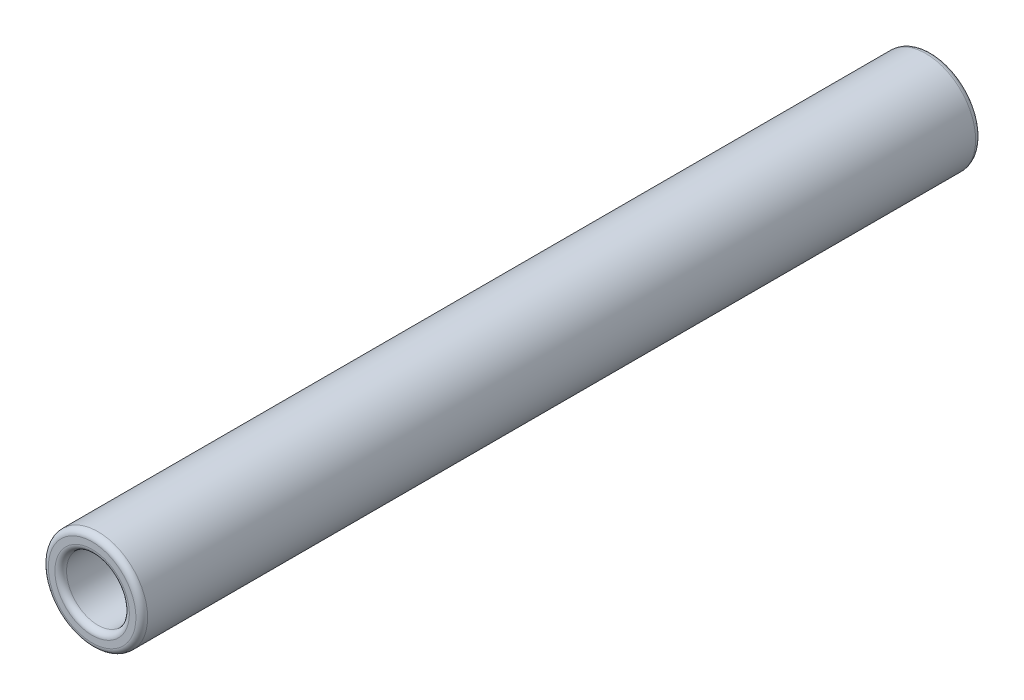
ISO-10303-21;
HEADER;
FILE_DESCRIPTION(('STEP AP214'),'2;1');
FILE_NAME('part.step','',(''),(''),'','','');
FILE_SCHEMA(('AUTOMOTIVE_DESIGN { 1 0 10303 214 1 1 1 1 }'));
ENDSEC;
DATA;
#1=APPLICATION_CONTEXT('core data for automotive mechanical design processes');
#2=APPLICATION_PROTOCOL_DEFINITION('international standard','automotive_design',2000,#1);
#3=PRODUCT_CONTEXT('',#1,'mechanical');
#4=PRODUCT('Part','Part','',(#3));
#5=PRODUCT_RELATED_PRODUCT_CATEGORY('part','',(#4));
#6=PRODUCT_DEFINITION_FORMATION('','',#4);
#7=PRODUCT_DEFINITION_CONTEXT('part definition',#1,'design');
#8=PRODUCT_DEFINITION('design','',#6,#7);
#9=PRODUCT_DEFINITION_SHAPE('','',#8);
#10=(LENGTH_UNIT() NAMED_UNIT(*) SI_UNIT(.MILLI.,.METRE.));
#11=(NAMED_UNIT(*) PLANE_ANGLE_UNIT() SI_UNIT($,.RADIAN.));
#12=(NAMED_UNIT(*) SI_UNIT($,.STERADIAN.) SOLID_ANGLE_UNIT());
#13=UNCERTAINTY_MEASURE_WITH_UNIT(LENGTH_MEASURE(1.E-05),#10,'distance_accuracy_value','');
#14=(GEOMETRIC_REPRESENTATION_CONTEXT(3) GLOBAL_UNCERTAINTY_ASSIGNED_CONTEXT((#13)) GLOBAL_UNIT_ASSIGNED_CONTEXT((#10,
#11,#12)) REPRESENTATION_CONTEXT('',''));
#15=CARTESIAN_POINT('',(0.,0.,0.));
#16=DIRECTION('',(0.,0.,1.));
#17=DIRECTION('',(1.,0.,0.));
#18=AXIS2_PLACEMENT_3D('',#15,#16,#17);
#19=CARTESIAN_POINT('',(0.,0.,146.05));
#20=DIRECTION('',(0.,0.,1.));
#21=DIRECTION('',(1.,0.,0.));
#22=AXIS2_PLACEMENT_3D('',#19,#20,#21);
#23=PLANE('',#22);
#24=CARTESIAN_POINT('',(0.,0.,146.05));
#25=DIRECTION('',(0.,0.,1.));
#26=DIRECTION('',(1.,0.,0.));
#27=AXIS2_PLACEMENT_3D('',#24,#25,#26);
#28=CIRCLE('',#27,6.477);
#29=CARTESIAN_POINT('',(6.477,0.,146.05));
#30=VERTEX_POINT('',#29);
#31=EDGE_CURVE('E65',#30,#30,#28,.F.);
#32=ORIENTED_EDGE('',*,*,#31,.T.);
#33=EDGE_LOOP('',(#32));
#34=FACE_BOUND('',#33,.T.);
#35=CARTESIAN_POINT('',(0.,0.,146.05));
#36=DIRECTION('',(0.,0.,1.));
#37=DIRECTION('',(1.,0.,0.));
#38=AXIS2_PLACEMENT_3D('',#35,#36,#37);
#39=CIRCLE('',#38,7.62);
#40=CARTESIAN_POINT('',(7.62,0.,146.05));
#41=VERTEX_POINT('',#40);
#42=EDGE_CURVE('E69',#41,#41,#39,.T.);
#43=ORIENTED_EDGE('',*,*,#42,.T.);
#44=EDGE_LOOP('',(#43));
#45=FACE_BOUND('',#44,.T.);
#46=ADVANCED_FACE('F41',(#34,#45),#23,.T.);
#47=CARTESIAN_POINT('',(0.,0.,0.));
#48=DIRECTION('',(0.,0.,1.));
#49=DIRECTION('',(1.,0.,0.));
#50=AXIS2_PLACEMENT_3D('',#47,#48,#49);
#51=PLANE('',#50);
#52=CARTESIAN_POINT('',(0.,0.,0.));
#53=DIRECTION('',(0.,0.,1.));
#54=DIRECTION('',(1.,0.,0.));
#55=AXIS2_PLACEMENT_3D('',#52,#53,#54);
#56=CIRCLE('',#55,6.477);
#57=CARTESIAN_POINT('',(6.477,0.,0.));
#58=VERTEX_POINT('',#57);
#59=EDGE_CURVE('E10',#58,#58,#56,.T.);
#60=ORIENTED_EDGE('',*,*,#59,.T.);
#61=EDGE_LOOP('',(#60));
#62=FACE_BOUND('',#61,.T.);
#63=CARTESIAN_POINT('',(0.,0.,0.));
#64=DIRECTION('',(0.,0.,1.));
#65=DIRECTION('',(1.,0.,0.));
#66=AXIS2_PLACEMENT_3D('',#63,#64,#65);
#67=CIRCLE('',#66,7.62);
#68=CARTESIAN_POINT('',(7.62,0.,0.));
#69=VERTEX_POINT('',#68);
#70=EDGE_CURVE('E49',#69,#69,#67,.F.);
#71=ORIENTED_EDGE('',*,*,#70,.T.);
#72=EDGE_LOOP('',(#71));
#73=FACE_BOUND('',#72,.T.);
#74=ADVANCED_FACE('F97',(#62,#73),#51,.F.);
#75=CARTESIAN_POINT('',(0.,0.,146.05));
#76=DIRECTION('',(0.,0.,-1.));
#77=DIRECTION('',(-1.,0.,0.));
#78=AXIS2_PLACEMENT_3D('',#75,#76,#77);
#79=CYLINDRICAL_SURFACE('',#78,8.636);
#80=CARTESIAN_POINT('',(0.,0.,145.034));
#81=DIRECTION('',(0.,0.,1.));
#82=DIRECTION('',(1.,0.,0.));
#83=AXIS2_PLACEMENT_3D('',#80,#81,#82);
#84=CIRCLE('',#83,8.636);
#85=CARTESIAN_POINT('',(8.636,0.,145.034));
#86=VERTEX_POINT('',#85);
#87=EDGE_CURVE('E54',#86,#86,#84,.F.);
#88=ORIENTED_EDGE('',*,*,#87,.T.);
#89=EDGE_LOOP('',(#88));
#90=FACE_BOUND('',#89,.T.);
#91=CARTESIAN_POINT('',(0.,0.,1.01599999999999));
#92=DIRECTION('',(0.,0.,1.));
#93=DIRECTION('',(1.,0.,0.));
#94=AXIS2_PLACEMENT_3D('',#91,#92,#93);
#95=CIRCLE('',#94,8.636);
#96=CARTESIAN_POINT('',(8.636,0.,1.01599999999999));
#97=VERTEX_POINT('',#96);
#98=EDGE_CURVE('E59',#97,#97,#95,.T.);
#99=ORIENTED_EDGE('',*,*,#98,.T.);
#100=EDGE_LOOP('',(#99));
#101=FACE_BOUND('',#100,.T.);
#102=ADVANCED_FACE('F103',(#90,#101),#79,.T.);
#103=CARTESIAN_POINT('',(0.,0.,146.05));
#104=DIRECTION('',(0.,0.,-1.));
#105=DIRECTION('',(-1.,0.,0.));
#106=AXIS2_PLACEMENT_3D('',#103,#104,#105);
#107=CYLINDRICAL_SURFACE('',#106,5.461);
#108=CARTESIAN_POINT('',(0.,0.,145.034));
#109=DIRECTION('',(0.,0.,1.));
#110=DIRECTION('',(1.,0.,0.));
#111=AXIS2_PLACEMENT_3D('',#108,#109,#110);
#112=CIRCLE('',#111,5.461);
#113=CARTESIAN_POINT('',(5.461,0.,145.034));
#114=VERTEX_POINT('',#113);
#115=EDGE_CURVE('E73',#114,#114,#112,.T.);
#116=ORIENTED_EDGE('',*,*,#115,.T.);
#117=EDGE_LOOP('',(#116));
#118=FACE_BOUND('',#117,.T.);
#119=CARTESIAN_POINT('',(0.,0.,1.01599999999999));
#120=DIRECTION('',(0.,0.,1.));
#121=DIRECTION('',(1.,0.,0.));
#122=AXIS2_PLACEMENT_3D('',#119,#120,#121);
#123=CIRCLE('',#122,5.461);
#124=CARTESIAN_POINT('',(5.461,0.,1.01599999999999));
#125=VERTEX_POINT('',#124);
#126=EDGE_CURVE('E77',#125,#125,#123,.F.);
#127=ORIENTED_EDGE('',*,*,#126,.T.);
#128=EDGE_LOOP('',(#127));
#129=FACE_BOUND('',#128,.T.);
#130=ADVANCED_FACE('F82',(#118,#129),#107,.F.);
#131=CARTESIAN_POINT('',(0.,0.,145.034));
#132=DIRECTION('',(0.,0.,1.));
#133=DIRECTION('',(1.,0.,0.));
#134=AXIS2_PLACEMENT_3D('',#131,#132,#133);
#135=TOROIDAL_SURFACE('',#134,6.477,1.016);
#136=ORIENTED_EDGE('',*,*,#31,.F.);
#137=EDGE_LOOP('',(#136));
#138=FACE_BOUND('',#137,.T.);
#139=ORIENTED_EDGE('',*,*,#115,.F.);
#140=EDGE_LOOP('',(#139));
#141=FACE_BOUND('',#140,.T.);
#142=ADVANCED_FACE('F93',(#138,#141),#135,.T.);
#143=CARTESIAN_POINT('',(0.,0.,145.034));
#144=DIRECTION('',(0.,0.,1.));
#145=DIRECTION('',(1.,0.,0.));
#146=AXIS2_PLACEMENT_3D('',#143,#144,#145);
#147=TOROIDAL_SURFACE('',#146,7.62,1.016);
#148=ORIENTED_EDGE('',*,*,#87,.F.);
#149=EDGE_LOOP('',(#148));
#150=FACE_BOUND('',#149,.T.);
#151=ORIENTED_EDGE('',*,*,#42,.F.);
#152=EDGE_LOOP('',(#151));
#153=FACE_BOUND('',#152,.T.);
#154=ADVANCED_FACE('F87',(#150,#153),#147,.T.);
#155=CARTESIAN_POINT('',(0.,0.,1.01599999999999));
#156=DIRECTION('',(0.,0.,1.));
#157=DIRECTION('',(1.,0.,0.));
#158=AXIS2_PLACEMENT_3D('',#155,#156,#157);
#159=TOROIDAL_SURFACE('',#158,6.477,1.016);
#160=ORIENTED_EDGE('',*,*,#126,.F.);
#161=EDGE_LOOP('',(#160));
#162=FACE_BOUND('',#161,.T.);
#163=ORIENTED_EDGE('',*,*,#59,.F.);
#164=EDGE_LOOP('',(#163));
#165=FACE_BOUND('',#164,.T.);
#166=ADVANCED_FACE('F84',(#162,#165),#159,.T.);
#167=CARTESIAN_POINT('',(0.,0.,1.01599999999999));
#168=DIRECTION('',(0.,0.,1.));
#169=DIRECTION('',(1.,0.,0.));
#170=AXIS2_PLACEMENT_3D('',#167,#168,#169);
#171=TOROIDAL_SURFACE('',#170,7.62,1.016);
#172=ORIENTED_EDGE('',*,*,#70,.F.);
#173=EDGE_LOOP('',(#172));
#174=FACE_BOUND('',#173,.T.);
#175=ORIENTED_EDGE('',*,*,#98,.F.);
#176=EDGE_LOOP('',(#175));
#177=FACE_BOUND('',#176,.T.);
#178=ADVANCED_FACE('F43',(#174,#177),#171,.T.);
#179=CLOSED_SHELL('',(#46,#74,#102,#130,#142,#154,#166,#178));
#180=MANIFOLD_SOLID_BREP('B2',#179);
#181=ADVANCED_BREP_SHAPE_REPRESENTATION('',(#18,#180),#14);
#182=SHAPE_DEFINITION_REPRESENTATION(#9,#181);
ENDSEC;
END-ISO-10303-21;
